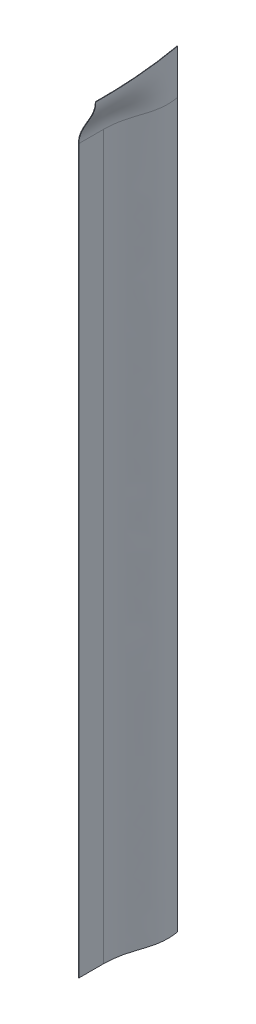
ISO-10303-21;
HEADER;
FILE_DESCRIPTION(('STEP AP214'),'2;1');
FILE_NAME('part.step','',(''),(''),'','','');
FILE_SCHEMA(('AUTOMOTIVE_DESIGN { 1 0 10303 214 1 1 1 1 }'));
ENDSEC;
DATA;
#1=APPLICATION_CONTEXT('core data for automotive mechanical design processes');
#2=APPLICATION_PROTOCOL_DEFINITION('international standard','automotive_design',2000,#1);
#3=PRODUCT_CONTEXT('',#1,'mechanical');
#4=PRODUCT('Part','Part','',(#3));
#5=PRODUCT_RELATED_PRODUCT_CATEGORY('part','',(#4));
#6=PRODUCT_DEFINITION_FORMATION('','',#4);
#7=PRODUCT_DEFINITION_CONTEXT('part definition',#1,'design');
#8=PRODUCT_DEFINITION('design','',#6,#7);
#9=PRODUCT_DEFINITION_SHAPE('','',#8);
#10=(LENGTH_UNIT() NAMED_UNIT(*) SI_UNIT(.MILLI.,.METRE.));
#11=(NAMED_UNIT(*) PLANE_ANGLE_UNIT() SI_UNIT($,.RADIAN.));
#12=(NAMED_UNIT(*) SI_UNIT($,.STERADIAN.) SOLID_ANGLE_UNIT());
#13=UNCERTAINTY_MEASURE_WITH_UNIT(LENGTH_MEASURE(1.E-05),#10,'distance_accuracy_value','');
#14=(GEOMETRIC_REPRESENTATION_CONTEXT(3) GLOBAL_UNCERTAINTY_ASSIGNED_CONTEXT((#13)) GLOBAL_UNIT_ASSIGNED_CONTEXT((#10,
#11,#12)) REPRESENTATION_CONTEXT('',''));
#15=CARTESIAN_POINT('',(0.,0.,0.));
#16=DIRECTION('',(0.,0.,1.));
#17=DIRECTION('',(1.,0.,0.));
#18=AXIS2_PLACEMENT_3D('',#15,#16,#17);
#19=CARTESIAN_POINT('',(2097.2,0.,12.4));
#20=DIRECTION('',(0.,0.,-1.));
#21=DIRECTION('',(0.,-1.,0.));
#22=AXIS2_PLACEMENT_3D('',#19,#20,#21);
#23=PLANE('',#22);
#24=CARTESIAN_POINT('',(2096.2,0.,12.4));
#25=CARTESIAN_POINT('',(2097.2,0.,12.4));
#26=B_SPLINE_CURVE_WITH_KNOTS('',1,(#24,#25),.UNSPECIFIED.,.F.,.F.,(2,2),(0.,1.),.UNSPECIFIED.);
#27=CARTESIAN_POINT('',(2096.2,0.,12.4));
#28=VERTEX_POINT('',#27);
#29=CARTESIAN_POINT('',(2097.2,0.,12.4));
#30=VERTEX_POINT('',#29);
#31=EDGE_CURVE('E12',#28,#30,#26,.T.);
#32=ORIENTED_EDGE('',*,*,#31,.F.);
#33=DIRECTION('',(0.,1.,0.));
#34=VECTOR('',#33,1.);
#35=CARTESIAN_POINT('',(2096.2,0.,12.4));
#36=LINE('',#35,#34);
#37=CARTESIAN_POINT('',(2096.2,-1628.,12.4));
#38=VERTEX_POINT('',#37);
#39=EDGE_CURVE('E167',#28,#38,#36,.F.);
#40=ORIENTED_EDGE('',*,*,#39,.T.);
#41=DIRECTION('',(1.,0.,0.));
#42=VECTOR('',#41,1.);
#43=CARTESIAN_POINT('',(2097.2,-1628.,12.4));
#44=LINE('',#43,#42);
#45=CARTESIAN_POINT('',(2097.2,-1628.,12.4));
#46=VERTEX_POINT('',#45);
#47=EDGE_CURVE('E96',#38,#46,#44,.T.);
#48=ORIENTED_EDGE('',*,*,#47,.T.);
#49=DIRECTION('',(0.,-1.,0.));
#50=VECTOR('',#49,1.);
#51=CARTESIAN_POINT('',(2097.2,0.,12.4));
#52=LINE('',#51,#50);
#53=EDGE_CURVE('E363',#30,#46,#52,.T.);
#54=ORIENTED_EDGE('',*,*,#53,.F.);
#55=EDGE_LOOP('',(#32,#40,#48,#54));
#56=FACE_BOUND('',#55,.T.);
#57=ADVANCED_FACE('F84',(#56),#23,.F.);
#58=CARTESIAN_POINT('',(2110.51087200424,-1628.,-116.599616087288));
#59=DIRECTION('',(0.,1.,0.));
#60=DIRECTION('',(0.,0.,1.));
#61=AXIS2_PLACEMENT_3D('',#58,#59,#60);
#62=PLANE('',#61);
#63=CARTESIAN_POINT('',(2097.2,-1628.,-42.6));
#64=CARTESIAN_POINT('',(2097.2,-1628.,-106.912759064299));
#65=CARTESIAN_POINT('',(2129.23437119317,-1628.,-128.285705284854));
#66=CARTESIAN_POINT('',(2118.40911682379,-1628.,-188.6));
#67=B_SPLINE_CURVE_WITH_KNOTS('',3,(#63,#64,#65,#66),.UNSPECIFIED.,.F.,.F.,(4,4),(0.,1.),.UNSPECIFIED.);
#68=CARTESIAN_POINT('',(2097.2,-1628.,-42.6));
#69=VERTEX_POINT('',#68);
#70=CARTESIAN_POINT('',(2118.40911682379,-1628.,-188.6));
#71=VERTEX_POINT('',#70);
#72=EDGE_CURVE('E173',#69,#71,#67,.T.);
#73=ORIENTED_EDGE('',*,*,#72,.F.);
#74=DIRECTION('',(0.,0.,-1.));
#75=VECTOR('',#74,1.);
#76=CARTESIAN_POINT('',(2097.2,-1628.,12.4));
#77=LINE('',#76,#75);
#78=EDGE_CURVE('E346',#46,#69,#77,.T.);
#79=ORIENTED_EDGE('',*,*,#78,.F.);
#80=ORIENTED_EDGE('',*,*,#47,.F.);
#81=DIRECTION('',(0.,0.,1.));
#82=VECTOR('',#81,1.);
#83=CARTESIAN_POINT('',(2096.2,-1628.,12.4));
#84=LINE('',#83,#82);
#85=CARTESIAN_POINT('',(2096.2,-1628.,-42.6));
#86=VERTEX_POINT('',#85);
#87=EDGE_CURVE('E477',#38,#86,#84,.F.);
#88=ORIENTED_EDGE('',*,*,#87,.T.);
#89=CARTESIAN_POINT('',(2096.2,-1628.,-42.6000000011509));
#90=CARTESIAN_POINT('',(2096.19990502715,-1628.,-44.5793698336326));
#91=CARTESIAN_POINT('',(2096.23018262602,-1628.,-46.5588160641818));
#92=CARTESIAN_POINT('',(2096.35151660415,-1628.,-50.438728948176));
#93=CARTESIAN_POINT('',(2096.44016217413,-1628.,-52.3392717592438));
#94=CARTESIAN_POINT('',(2096.67357865754,-1628.,-56.066249433123));
#95=CARTESIAN_POINT('',(2096.81614808163,-1628.,-57.8928207308748));
#96=CARTESIAN_POINT('',(2097.15249304741,-1628.,-61.4765869409018));
#97=CARTESIAN_POINT('',(2097.34429794904,-1628.,-63.233968858857));
#98=CARTESIAN_POINT('',(2097.9794804608,-1628.,-68.3282263089134));
#99=CARTESIAN_POINT('',(2098.49352046335,-1628.,-71.6565802443127));
#100=CARTESIAN_POINT('',(2099.67505619569,-1628.,-78.0921295844799));
#101=CARTESIAN_POINT('',(2100.3322973433,-1628.,-81.2012367614997));
#102=CARTESIAN_POINT('',(2101.75914326479,-1628.,-87.2377505073896));
#103=CARTESIAN_POINT('',(2102.52194376969,-1628.,-90.1667832511682));
#104=CARTESIAN_POINT('',(2104.11935034265,-1628.,-95.8828694121613));
#105=CARTESIAN_POINT('',(2104.95004104033,-1628.,-98.6710344899409));
#106=CARTESIAN_POINT('',(2106.64348015437,-1628.,-104.145645340672));
#107=CARTESIAN_POINT('',(2107.50451550666,-1628.,-106.832630368816));
#108=CARTESIAN_POINT('',(2109.21991885953,-1628.,-112.145371868147));
#109=CARTESIAN_POINT('',(2110.07403656934,-1628.,-114.771210497315));
#110=CARTESIAN_POINT('',(2111.73801771725,-1628.,-120.002131856168));
#111=CARTESIAN_POINT('',(2112.54829117227,-1628.,-122.607082022911));
#112=CARTESIAN_POINT('',(2114.08815083375,-1628.,-127.836925792426));
#113=CARTESIAN_POINT('',(2114.81786190087,-1628.,-130.461781598659));
#114=CARTESIAN_POINT('',(2115.82248893525,-1628.,-134.430917832449));
#115=CARTESIAN_POINT('',(2116.14325243351,-1628.,-135.763573779679));
#116=CARTESIAN_POINT('',(2116.75157586256,-1628.,-138.448796102679));
#117=CARTESIAN_POINT('',(2117.03881952384,-1628.,-139.801434558344));
#118=CARTESIAN_POINT('',(2117.57579334893,-1628.,-142.531709758811));
#119=CARTESIAN_POINT('',(2117.82501074076,-1628.,-143.909447834702));
#120=CARTESIAN_POINT('',(2118.28169899438,-1628.,-146.69504189206));
#121=CARTESIAN_POINT('',(2118.48841912707,-1628.,-148.103021535132));
#122=CARTESIAN_POINT('',(2118.85589793826,-1628.,-150.954249672633));
#123=CARTESIAN_POINT('',(2119.01563099993,-1628.,-152.397630900081));
#124=CARTESIAN_POINT('',(2119.28493765844,-1628.,-155.3248452835));
#125=CARTESIAN_POINT('',(2119.39318255985,-1628.,-156.808801075264));
#126=CARTESIAN_POINT('',(2119.5553126968,-1628.,-159.822376510054));
#127=CARTESIAN_POINT('',(2119.60754948588,-1628.,-161.352084931298));
#128=CARTESIAN_POINT('',(2119.6534465387,-1628.,-164.462401591432));
#129=CARTESIAN_POINT('',(2119.64513554964,-1628.,-166.043038596721));
#130=CARTESIAN_POINT('',(2119.56568862979,-1628.,-169.260461173176));
#131=CARTESIAN_POINT('',(2119.49226969245,-1628.,-170.897189440844));
#132=CARTESIAN_POINT('',(2119.27831808195,-1628.,-174.232059496873));
#133=CARTESIAN_POINT('',(2119.13521490906,-1628.,-175.930035172123));
#134=CARTESIAN_POINT('',(2118.77754906701,-1628.,-179.392620948449));
#135=CARTESIAN_POINT('',(2118.56016304896,-1628.,-181.156936263098));
#136=CARTESIAN_POINT('',(2118.04956125865,-1628.,-184.757570124325));
#137=CARTESIAN_POINT('',(2117.75331308361,-1628.,-186.59346068506));
#138=CARTESIAN_POINT('',(2117.42484451491,-1628.,-188.423342076413));
#139=B_SPLINE_CURVE_WITH_KNOTS('',3,(#89,#90,#91,#92,#93,#94,#95,#96,#97,#98,#99,#100,#101,#102,
#103,#104,#105,#106,#107,#108,#109,#110,#111,#112,#113,#114,#115,#116,#117,#118,#119,#120,#121,
#122,#123,#124,#125,#126,#127,#128,#129,#130,#131,#132,#133,#134,#135,#136,#137,#138),
.UNSPECIFIED.,.F.,.F.,(4,2,2,2,2,2,2,2,2,2,2,2,2,2,2,2,2,2,2,2,2,2,2,2,4),(0.,5.93797783504371,
11.6449026489515,17.1403530017418,22.4431232814159,32.5403385186683,42.0697649595287,
51.1474109368386,59.874164470115,68.3387201667411,76.6225127654291,84.8062148293339,
92.9770497441407,97.0887798413055,101.236612522311,105.436197644087,109.704576583658,
114.060185370628,118.522800121677,123.113430308563,127.854169966007,132.768020417092,
137.878699370403,143.210450578175,148.787865745676),.UNSPECIFIED.);
#140=CARTESIAN_POINT('',(2117.42484451504,-1628.,-188.423342075684));
#141=VERTEX_POINT('',#140);
#142=EDGE_CURVE('E471',#86,#141,#139,.T.);
#143=ORIENTED_EDGE('',*,*,#142,.T.);
#144=DIRECTION('',(0.984272308752147,0.,-0.176657924316226));
#145=VECTOR('',#144,1.);
#146=CARTESIAN_POINT('',(2118.40911682379,-1628.,-188.6));
#147=LINE('',#146,#145);
#148=EDGE_CURVE('E156',#141,#71,#147,.T.);
#149=ORIENTED_EDGE('',*,*,#148,.T.);
#150=EDGE_LOOP('',(#73,#79,#80,#88,#143,#149));
#151=FACE_BOUND('',#150,.T.);
#152=ADVANCED_FACE('F329',(#151),#62,.F.);
#153=CARTESIAN_POINT('',(2118.40911682379,0.,-188.6));
#154=DIRECTION('',(-0.176657924316203,0.,-0.984272308752152));
#155=DIRECTION('',(-0.984272308752152,0.,0.176657924316203));
#156=AXIS2_PLACEMENT_3D('',#153,#154,#155);
#157=PLANE('',#156);
#158=CARTESIAN_POINT('',(2118.40911682379,0.,-188.6));
#159=CARTESIAN_POINT('',(2118.40911682379,33.3333333333333,-188.6));
#160=CARTESIAN_POINT('',(2118.40911682379,66.6666666666667,-188.599999999999));
#161=CARTESIAN_POINT('',(2118.40911682379,100.,-188.599999999999));
#162=B_SPLINE_CURVE_WITH_KNOTS('',3,(#158,#159,#160,#161),.UNSPECIFIED.,.F.,.F.,(4,4),(0.,1.),.UNSPECIFIED.);
#163=CARTESIAN_POINT('',(2118.40911682379,0.,-188.6));
#164=VERTEX_POINT('',#163);
#165=CARTESIAN_POINT('',(2118.40911682379,100.,-188.599999999999));
#166=VERTEX_POINT('',#165);
#167=EDGE_CURVE('E360',#164,#166,#162,.T.);
#168=ORIENTED_EDGE('',*,*,#167,.F.);
#169=DIRECTION('',(0.,-1.,0.));
#170=VECTOR('',#169,1.);
#171=CARTESIAN_POINT('',(2118.40911682379,0.,-188.6));
#172=LINE('',#171,#170);
#173=EDGE_CURVE('E352',#164,#71,#172,.T.);
#174=ORIENTED_EDGE('',*,*,#173,.T.);
#175=ORIENTED_EDGE('',*,*,#148,.F.);
#176=DIRECTION('',(0.,-1.,0.));
#177=VECTOR('',#176,1.);
#178=CARTESIAN_POINT('',(2117.42484451504,0.,-188.423342075684));
#179=LINE('',#178,#177);
#180=CARTESIAN_POINT('',(2117.42484451504,0.,-188.423342075684));
#181=VERTEX_POINT('',#180);
#182=EDGE_CURVE('E163',#181,#141,#179,.T.);
#183=ORIENTED_EDGE('',*,*,#182,.F.);
#184=CARTESIAN_POINT('',(2117.42484451504,0.,-188.423342075684));
#185=CARTESIAN_POINT('',(2117.42484451504,16.6666666666667,-188.423342075684));
#186=CARTESIAN_POINT('',(2117.42484451504,33.3333333333333,-188.423342075684));
#187=CARTESIAN_POINT('',(2117.42484451504,58.3333333333333,-188.423342075683));
#188=CARTESIAN_POINT('',(2117.42484451504,66.6666666666667,-188.423342075683));
#189=CARTESIAN_POINT('',(2117.42484451504,83.3333333333333,-188.423342075683));
#190=CARTESIAN_POINT('',(2117.42484451504,91.6666666666667,-188.423342075683));
#191=CARTESIAN_POINT('',(2117.42484451504,100.,-188.423342075683));
#192=B_SPLINE_CURVE_WITH_KNOTS('',3,(#184,#185,#186,#187,#188,#189,#190,#191),.UNSPECIFIED.,.F.,
.F.,(4,2,2,4),(0.,50.,75.,100.),.UNSPECIFIED.);
#193=CARTESIAN_POINT('',(2117.42484451504,100.,-188.423342075683));
#194=VERTEX_POINT('',#193);
#195=EDGE_CURVE('E160',#181,#194,#192,.T.);
#196=ORIENTED_EDGE('',*,*,#195,.T.);
#197=CARTESIAN_POINT('',(2117.42484451504,100.,-188.423342075683));
#198=CARTESIAN_POINT('',(2117.50687087374,100.,-188.438064227407));
#199=CARTESIAN_POINT('',(2117.58889723244,100.,-188.452786379131));
#200=CARTESIAN_POINT('',(2117.75294994984,100.,-188.482230682579));
#201=CARTESIAN_POINT('',(2117.83497630854,100.,-188.496952834303));
#202=CARTESIAN_POINT('',(2118.08104071943,100.,-188.541116657351));
#203=CARTESIAN_POINT('',(2118.24507877161,100.,-188.570558328675));
#204=CARTESIAN_POINT('',(2118.40911682379,100.,-188.599999999999));
#205=B_SPLINE_CURVE_WITH_KNOTS('',3,(#197,#198,#199,#200,#201,#202,#203,#204),.UNSPECIFIED.,.F.,
.F.,(4,2,2,4),(0.,0.250011174665922,0.500022349331874,1.00000000000012),.UNSPECIFIED.);
#206=EDGE_CURVE('E146',#194,#166,#205,.T.);
#207=ORIENTED_EDGE('',*,*,#206,.T.);
#208=EDGE_LOOP('',(#168,#174,#175,#183,#196,#207));
#209=FACE_BOUND('',#208,.T.);
#210=ADVANCED_FACE('F161',(#209),#157,.T.);
#211=CARTESIAN_POINT('',(2118.40911682379,100.,-188.599999999999));
#212=DIRECTION('',(0.,1.,0.));
#213=DIRECTION('',(-0.984272308752156,0.,0.176657924316176));
#214=AXIS2_PLACEMENT_3D('',#211,#212,#213);
#215=PLANE('',#214);
#216=ORIENTED_EDGE('',*,*,#206,.F.);
#217=CARTESIAN_POINT('',(2117.42484451504,100.,-188.423342075683));
#218=CARTESIAN_POINT('',(2117.91178197751,100.,-185.710232373201));
#219=CARTESIAN_POINT('',(2118.3881193827,100.,-182.995222267723));
#220=CARTESIAN_POINT('',(2119.31969577176,100.,-177.561586026702));
#221=CARTESIAN_POINT('',(2119.77493476611,100.,-174.842959892954));
#222=CARTESIAN_POINT('',(2120.66443136324,100.,-169.402182824546));
#223=CARTESIAN_POINT('',(2121.09868826478,100.,-166.680031775195));
#224=CARTESIAN_POINT('',(2121.94620497464,100.,-161.232468893543));
#225=CARTESIAN_POINT('',(2122.35946477662,100.,-158.507057060255));
#226=CARTESIAN_POINT('',(2123.56770280458,100.,-150.326080262677));
#227=CARTESIAN_POINT('',(2124.33113250242,100.,-144.865817735663));
#228=CARTESIAN_POINT('',(2125.77214994862,100.,-133.935913183818));
#229=CARTESIAN_POINT('',(2126.44976716576,100.,-128.466275036221));
#230=CARTESIAN_POINT('',(2127.72034870304,100.,-117.517268191796));
#231=CARTESIAN_POINT('',(2128.31331435345,100.,-112.037899649247));
#232=CARTESIAN_POINT('',(2129.41464271444,100.,-101.07082151532));
#233=CARTESIAN_POINT('',(2129.92300819868,100.,-95.5831122033536));
#234=CARTESIAN_POINT('',(2130.62905499581,100.,-87.2550861389634));
#235=CARTESIAN_POINT('',(2130.85812611098,100.,-84.417397726531));
#236=CARTESIAN_POINT('',(2131.29349397135,100.,-78.7403039952867));
#237=CARTESIAN_POINT('',(2131.49979100154,100.,-75.9008986984062));
#238=CARTESIAN_POINT('',(2131.8896716982,100.,-70.220532713023));
#239=CARTESIAN_POINT('',(2132.07325537851,100.,-67.379572025469));
#240=CARTESIAN_POINT('',(2132.41772597561,100.,-61.6962978414668));
#241=CARTESIAN_POINT('',(2132.57861307781,100.,-58.8539843562601));
#242=CARTESIAN_POINT('',(2132.87767673184,100.,-53.1681582286987));
#243=CARTESIAN_POINT('',(2133.01585324623,100.,-50.3246455843753));
#244=CARTESIAN_POINT('',(2133.26941863,100.,-44.6366207249578));
#245=CARTESIAN_POINT('',(2133.3848076331,100.,-41.7921085158275));
#246=CARTESIAN_POINT('',(2133.59299093205,100.,-36.0959776832799));
#247=CARTESIAN_POINT('',(2133.68573484467,100.,-33.244357220516));
#248=CARTESIAN_POINT('',(2133.84832044127,100.,-27.5404529256612));
#249=CARTESIAN_POINT('',(2133.91816206885,100.,-24.688169091954));
#250=CARTESIAN_POINT('',(2134.00575238443,100.,-20.409382710622));
#251=CARTESIAN_POINT('',(2134.03208725486,100.,-18.9830508706681));
#252=CARTESIAN_POINT('',(2134.0790340287,100.,-16.1302905919716));
#253=CARTESIAN_POINT('',(2134.09964592715,100.,-14.7038621531466));
#254=CARTESIAN_POINT('',(2134.12923034158,100.,-12.326426940495));
#255=CARTESIAN_POINT('',(2134.1397924353,100.,-11.375439565598));
#256=CARTESIAN_POINT('',(2134.15837382631,100.,-9.47344049960771));
#257=CARTESIAN_POINT('',(2134.16639312536,100.,-8.52242880853165));
#258=CARTESIAN_POINT('',(2134.17988797628,100.,-6.62038975425363));
#259=CARTESIAN_POINT('',(2134.18536353471,100.,-5.66936239109846));
#260=CARTESIAN_POINT('',(2134.19167227653,100.,-4.24281370034143));
#261=CARTESIAN_POINT('',(2134.19345775746,100.,-3.76729641221583));
#262=CARTESIAN_POINT('',(2134.19638860059,100.,-2.81626001457154));
#263=CARTESIAN_POINT('',(2134.19753396302,100.,-2.34074090505353));
#264=CARTESIAN_POINT('',(2134.19920603035,100.,-1.38970067920241));
#265=CARTESIAN_POINT('',(2134.1997327341,100.,-0.914179562867199));
#266=CARTESIAN_POINT('',(2134.19999840388,100.,-0.200897674447772));
#267=CARTESIAN_POINT('',(2134.19999956279,100.,0.0368630312709143));
#268=CARTESIAN_POINT('',(2134.20000043721,100.,0.512384444106765));
#269=CARTESIAN_POINT('',(2134.20000015271,100.,0.750145151223929));
#270=CARTESIAN_POINT('',(2134.19999969458,100.,1.46342814452927));
#271=CARTESIAN_POINT('',(2134.19999991632,100.,1.93895043307451));
#272=CARTESIAN_POINT('',(2134.20000008368,100.,2.88999499978504));
#273=CARTESIAN_POINT('',(2134.20000002929,100.,3.36551727795033));
#274=CARTESIAN_POINT('',(2134.19999994143,100.,4.79203854977996));
#275=CARTESIAN_POINT('',(2134.19999998327,100.,5.74303754389322));
#276=CARTESIAN_POINT('',(2134.20000001673,100.,7.64503304887715));
#277=CARTESIAN_POINT('',(2134.20000000837,100.,8.59602955974782));
#278=CARTESIAN_POINT('',(2134.19999999163,100.,10.4980173803626));
#279=CARTESIAN_POINT('',(2134.19999998327,100.,11.4490086901068));
#280=CARTESIAN_POINT('',(2134.2,100.,12.4000000000006));
#281=B_SPLINE_CURVE_WITH_KNOTS('',3,(#217,#218,#219,#220,#221,#222,#223,#224,#225,#226,#227,
#228,#229,#230,#231,#232,#233,#234,#235,#236,#237,#238,#239,#240,#241,#242,#243,#244,#245,#246,
#247,#248,#249,#250,#251,#252,#253,#254,#255,#256,#257,#258,#259,#260,#261,#262,#263,#264,#265,
#266,#267,#268,#269,#270,#271,#272,#273,#274,#275,#276,#277,#278,#279,#280),.UNSPECIFIED.,.F.,
.F.,(4,2,2,2,2,2,2,2,2,2,2,2,2,2,2,2,2,2,2,2,2,2,2,2,2,2,2,2,2,2,2,4),(0.,8.26935586366066,
16.5387076258297,24.8083355710459,33.0779660215668,49.6173598554222,66.1510584202685,
82.6844971362546,99.2173936886634,107.758074363038,116.298648151504,124.8392167359,
133.379715547593,141.9202284356,150.460691205333,159.019986021266,167.579301912177,
171.859017506722,176.138736803623,178.991871855254,181.845004931658,184.698130644164,
186.124692201635,187.551253263816,188.977816969561,189.69109906599,190.40438119243,
191.830948054099,193.257514889568,196.11051187116,198.963501403921,201.816475333303),.UNSPECIFIED.);
#282=CARTESIAN_POINT('',(2134.2,100.,12.4000000000006));
#283=VERTEX_POINT('',#282);
#284=EDGE_CURVE('E149',#194,#283,#281,.T.);
#285=ORIENTED_EDGE('',*,*,#284,.T.);
#286=CARTESIAN_POINT('',(2134.2,100.,12.4000000000006));
#287=CARTESIAN_POINT('',(2134.28366382318,100.,12.4000000000005));
#288=CARTESIAN_POINT('',(2134.36732764637,100.,12.4000000000005));
#289=CARTESIAN_POINT('',(2134.53465529274,100.,12.4000000000004));
#290=CARTESIAN_POINT('',(2134.61831911592,100.,12.4000000000003));
#291=CARTESIAN_POINT('',(2134.86798862607,100.,12.4000000000002));
#292=CARTESIAN_POINT('',(2135.03399431304,99.9999999999999,12.4000000000001));
#293=CARTESIAN_POINT('',(2135.2,100.,12.4));
#294=B_SPLINE_CURVE_WITH_KNOTS('',3,(#286,#287,#288,#289,#290,#291,#292,#293),.UNSPECIFIED.,.F.,
.F.,(4,2,2,4),(0.,0.250991469555206,0.501982939109968,0.99999999999989),.UNSPECIFIED.);
#295=CARTESIAN_POINT('',(2135.2,100.,12.4));
#296=VERTEX_POINT('',#295);
#297=EDGE_CURVE('E139',#283,#296,#294,.T.);
#298=ORIENTED_EDGE('',*,*,#297,.T.);
#299=CARTESIAN_POINT('',(2118.40911682379,100.,-188.599999999999));
#300=CARTESIAN_POINT('',(2119.88208806674,100.,-180.393151585847));
#301=CARTESIAN_POINT('',(2121.95195860461,100.,-168.022680719978));
#302=CARTESIAN_POINT('',(2124.41820818405,100.,-151.514741664519));
#303=CARTESIAN_POINT('',(2126.11750517861,100.,-139.153403069519));
#304=CARTESIAN_POINT('',(2127.66281069534,100.,-126.838284818192));
#305=CARTESIAN_POINT('',(2129.05557294793,100.,-114.591784061294));
#306=CARTESIAN_POINT('',(2130.29724015011,100.,-102.436297949585));
#307=CARTESIAN_POINT('',(2131.75326730406,100.,-86.3801988618984));
#308=CARTESIAN_POINT('',(2132.91289721201,100.,-70.595717667617));
#309=CARTESIAN_POINT('',(2133.79589889138,100.,-55.1354005603097));
#310=CARTESIAN_POINT('',(2134.50107142417,100.,-39.9087082421751));
#311=CARTESIAN_POINT('',(2135.06146307623,100.,-21.3462306951862));
#312=CARTESIAN_POINT('',(2135.2,100.,-7.02340488495266));
#313=CARTESIAN_POINT('',(2135.2,100.,2.78610772566117));
#314=CARTESIAN_POINT('',(2135.2,99.9999999999999,4.32038402832956));
#315=CARTESIAN_POINT('',(2135.2,100.,7.77245619494941));
#316=CARTESIAN_POINT('',(2135.2,99.9999999999999,9.92087628852595));
#317=CARTESIAN_POINT('',(2135.2,100.,11.6139298361816));
#318=CARTESIAN_POINT('',(2135.2,100.,12.4));
#319=B_SPLINE_CURVE_WITH_KNOTS('',3,(#299,#300,#301,#302,#303,#304,#305,#306,#307,#308,#309,
#310,#311,#312,#313,#314,#315,#316,#317,#318),.UNSPECIFIED.,.F.,.F.,(4,1,1,1,1,1,1,1,1,1,1,1,2,
1,1,1,4),(0.,0.104310570158004,0.156465855237007,0.208621140316009,0.260776425395011,
0.312931710474013,0.365086995553016,0.417242280632018,0.521552850790022,0.573708135869025,
0.625863420948027,0.730173991106031,0.834484561264036,0.875863420948027,0.917242280632018,
0.958621140316009,1.),.UNSPECIFIED.);
#320=EDGE_CURVE('E152',#166,#296,#319,.T.);
#321=ORIENTED_EDGE('',*,*,#320,.F.);
#322=EDGE_LOOP('',(#216,#285,#298,#321));
#323=FACE_BOUND('',#322,.T.);
#324=ADVANCED_FACE('F86',(#323),#215,.T.);
#325=CARTESIAN_POINT('',(2135.2,100.,12.4));
#326=CARTESIAN_POINT('',(2135.2,95.5426402932279,12.4));
#327=CARTESIAN_POINT('',(2134.60625,91.1942904764953,12.4));
#328=CARTESIAN_POINT('',(2132.528125,82.6611056780895,12.4));
#329=CARTESIAN_POINT('',(2131.04375,78.4762706964163,12.4));
#330=CARTESIAN_POINT('',(2127.48125,70.2156106231093,12.4));
#331=CARTESIAN_POINT('',(2125.403125,66.1397855314755,12.4));
#332=CARTESIAN_POINT('',(2120.95,58.0426402932279,12.4));
#333=CARTESIAN_POINT('',(2118.575,54.0213201466139,12.4));
#334=CARTESIAN_POINT('',(2113.825,45.9786798533861,12.4));
#335=CARTESIAN_POINT('',(2111.45,41.9573597067721,12.4));
#336=CARTESIAN_POINT('',(2106.996875,33.8602144685244,12.4));
#337=CARTESIAN_POINT('',(2104.91875,29.7843893768907,12.4));
#338=CARTESIAN_POINT('',(2101.35625,21.5237293035838,12.4));
#339=CARTESIAN_POINT('',(2099.871875,17.3388943219105,12.4));
#340=CARTESIAN_POINT('',(2097.79375,8.80570952350468,12.4));
#341=CARTESIAN_POINT('',(2097.2,4.45735970677211,12.4));
#342=CARTESIAN_POINT('',(2097.2,0.,12.4));
#343=CARTESIAN_POINT('',(2134.2,100.,12.4000000000006));
#344=CARTESIAN_POINT('',(2134.2,95.6317889591355,12.4000000000006));
#345=CARTESIAN_POINT('',(2133.61841304395,91.3642353428358,12.397232994011));
#346=CARTESIAN_POINT('',(2131.57277321617,82.9643943342219,12.3945478567797));
#347=CARTESIAN_POINT('',(2130.10824934603,78.8322318267454,12.394380267859));
#348=CARTESIAN_POINT('',(2126.58027769514,70.6516485410154,12.3953933418695));
#349=CARTESIAN_POINT('',(2124.51694372154,66.603571924068,12.3964281186735));
#350=CARTESIAN_POINT('',(2120.08372753483,58.5426374746547,12.3983662198052));
#351=CARTESIAN_POINT('',(2117.7139577107,54.5298535044506,12.3992918456803));
#352=CARTESIAN_POINT('',(2112.9639577107,46.4872132112227,12.4007081543196));
#353=CARTESIAN_POINT('',(2110.58372740933,42.4573570112561,12.4012102194832));
#354=CARTESIAN_POINT('',(2106.11068983115,34.324002946651,12.4017505813105));
#355=CARTESIAN_POINT('',(2104.01776973102,30.2204312864212,12.4017888546788));
#356=CARTESIAN_POINT('',(2100.42073576726,21.8796957328942,12.4014877818176));
#357=CARTESIAN_POINT('',(2098.91651034856,17.6421866872059,12.4011405717174));
#358=CARTESIAN_POINT('',(2096.805910079,8.97565453645932,12.4004000258162));
#359=CARTESIAN_POINT('',(2096.2,4.54650813341957,12.4));
#360=CARTESIAN_POINT('',(2096.2,0.,12.4));
#361=B_SPLINE_SURFACE_WITH_KNOTS('',1,3,((#325,#326,#327,#328,#329,#330,#331,#332,#333,#334,
#335,#336,#337,#338,#339,#340,#341,#342),(#343,#344,#345,#346,#347,#348,#349,#350,#351,#352,
#353,#354,#355,#356,#357,#358,#359,#360)),.UNSPECIFIED.,.F.,.F.,.F.,(2,2),(4,2,2,2,2,2,2,2,4),
(0.,1.),(0.,0.125,0.25,0.375,0.5,0.625,0.75,0.875,1.),.UNSPECIFIED.);
#362=CARTESIAN_POINT('',(2134.2,100.,12.4000000000006));
#363=CARTESIAN_POINT('',(2134.2,95.6317889591355,12.4000000000006));
#364=CARTESIAN_POINT('',(2133.61841304395,91.3642353428358,12.397232994011));
#365=CARTESIAN_POINT('',(2131.57277321617,82.9643943342219,12.3945478567797));
#366=CARTESIAN_POINT('',(2130.10824934603,78.8322318267454,12.394380267859));
#367=CARTESIAN_POINT('',(2126.58027769514,70.6516485410154,12.3953933418695));
#368=CARTESIAN_POINT('',(2124.51694372154,66.603571924068,12.3964281186735));
#369=CARTESIAN_POINT('',(2120.08372753483,58.5426374746547,12.3983662198052));
#370=CARTESIAN_POINT('',(2117.7139577107,54.5298535044506,12.3992918456803));
#371=CARTESIAN_POINT('',(2112.9639577107,46.4872132112227,12.4007081543196));
#372=CARTESIAN_POINT('',(2110.58372740933,42.4573570112561,12.4012102194832));
#373=CARTESIAN_POINT('',(2106.11068983115,34.324002946651,12.4017505813105));
#374=CARTESIAN_POINT('',(2104.01776973102,30.2204312864212,12.4017888546788));
#375=CARTESIAN_POINT('',(2100.42073576726,21.8796957328942,12.4014877818176));
#376=CARTESIAN_POINT('',(2098.91651034856,17.6421866872059,12.4011405717174));
#377=CARTESIAN_POINT('',(2096.805910079,8.97565453645932,12.4004000258162));
#378=CARTESIAN_POINT('',(2096.2,4.54650813341957,12.4));
#379=CARTESIAN_POINT('',(2096.2,0.,12.4));
#380=B_SPLINE_CURVE_WITH_KNOTS('',3,(#362,#363,#364,#365,#366,#367,#368,#369,#370,#371,#372,
#373,#374,#375,#376,#377,#378,#379),.UNSPECIFIED.,.F.,.F.,(4,2,2,2,2,2,2,2,4),(0.,0.125,0.25,
0.375,0.5,0.625,0.75,0.875,1.),.UNSPECIFIED.);
#381=EDGE_CURVE('E171',#283,#28,#380,.T.);
#382=CARTESIAN_POINT('',(2135.2,100.,12.4));
#383=CARTESIAN_POINT('',(2135.2,64.3411223458231,12.4));
#384=CARTESIAN_POINT('',(2097.2,35.6588776541769,12.4));
#385=CARTESIAN_POINT('',(2097.2,0.,12.4));
#386=B_SPLINE_CURVE_WITH_KNOTS('',3,(#382,#383,#384,#385),.UNSPECIFIED.,.F.,.F.,(4,4),(0.,1.),.UNSPECIFIED.);
#387=EDGE_CURVE('E259',#296,#30,#386,.T.);
#388=ORIENTED_EDGE('',*,*,#381,.T.);
#389=ORIENTED_EDGE('',*,*,#31,.T.);
#390=ORIENTED_EDGE('',*,*,#387,.F.);
#391=ORIENTED_EDGE('',*,*,#297,.F.);
#392=EDGE_LOOP('',(#388,#389,#390,#391));
#393=FACE_BOUND('',#392,.T.);
#394=ADVANCED_FACE('F213',(#393),#361,.T.);
#395=CARTESIAN_POINT('',(2118.40911682379,100.,-188.599999999999));
#396=CARTESIAN_POINT('',(2118.40911682379,66.6666666666667,-188.599999999999));
#397=CARTESIAN_POINT('',(2118.40911682379,33.3333333333333,-188.6));
#398=CARTESIAN_POINT('',(2118.40911682379,0.,-188.6));
#399=CARTESIAN_POINT('',(2119.88208806674,100.,-180.393151585847));
#400=CARTESIAN_POINT('',(2119.88208806674,66.6497434385605,-180.393151585847));
#401=CARTESIAN_POINT('',(2119.44127554205,33.3502565614395,-182.849195168871));
#402=CARTESIAN_POINT('',(2119.44127554205,0.,-182.849195168871));
#403=CARTESIAN_POINT('',(2121.95195860461,100.,-168.022680719978));
#404=CARTESIAN_POINT('',(2121.95195860461,66.6243585964012,-168.022680719978));
#405=CARTESIAN_POINT('',(2120.51525210332,33.3756414035988,-174.134180537152));
#406=CARTESIAN_POINT('',(2120.51525210332,0.,-174.134180537152));
#407=CARTESIAN_POINT('',(2124.41820818405,100.,-151.514741664519));
#408=CARTESIAN_POINT('',(2124.41820818405,66.4555190915975,-151.514741664519));
#409=CARTESIAN_POINT('',(2120.73109858834,33.5444809084025,-162.398391623543));
#410=CARTESIAN_POINT('',(2120.73109858834,0.,-162.398391623543));
#411=CARTESIAN_POINT('',(2126.11750517861,100.,-139.153403069519));
#412=CARTESIAN_POINT('',(2126.11750517861,66.2747895738081,-139.153403069519));
#413=CARTESIAN_POINT('',(2120.23922240834,33.7252104261919,-153.57769423501));
#414=CARTESIAN_POINT('',(2120.23922240834,0.,-153.57769423501));
#415=CARTESIAN_POINT('',(2127.66281069534,100.,-126.838284818192));
#416=CARTESIAN_POINT('',(2127.66281069534,66.0251817298347,-126.838284818192));
#417=CARTESIAN_POINT('',(2119.083878432,33.9748182701653,-144.773779068907));
#418=CARTESIAN_POINT('',(2119.083878432,0.,-144.773779068907));
#419=CARTESIAN_POINT('',(2129.05557294793,100.,-114.591784061294));
#420=CARTESIAN_POINT('',(2129.05557294793,65.6981084177675,-114.591784061294));
#421=CARTESIAN_POINT('',(2117.31116045817,34.3018915822324,-136.017793462533));
#422=CARTESIAN_POINT('',(2117.31116045817,0.,-136.017793462533));
#423=CARTESIAN_POINT('',(2130.29724015011,100.,-102.436297949585));
#424=CARTESIAN_POINT('',(2130.29724015011,65.2879019826712,-102.436297949585));
#425=CARTESIAN_POINT('',(2115.02520282533,34.7120980173289,-127.311934070336));
#426=CARTESIAN_POINT('',(2115.02520282533,0.,-127.311934070336));
#427=CARTESIAN_POINT('',(2131.75326730406,100.,-86.3801988618984));
#428=CARTESIAN_POINT('',(2131.75326730406,64.6389435905973,-86.3801988618984));
#429=CARTESIAN_POINT('',(2111.49280877256,35.3610564094026,-115.729136604228));
#430=CARTESIAN_POINT('',(2111.49280877256,0.,-115.729136604228));
#431=CARTESIAN_POINT('',(2132.91289721201,100.,-70.595717667617));
#432=CARTESIAN_POINT('',(2132.91289721201,63.8681771869587,-70.595717667617));
#433=CARTESIAN_POINT('',(2107.58680629837,36.1318228130414,-104.061290120005));
#434=CARTESIAN_POINT('',(2107.58680629837,0.,-104.061290120005));
#435=CARTESIAN_POINT('',(2133.79589889138,100.,-55.1354005603097));
#436=CARTESIAN_POINT('',(2133.79589889138,63.1213805000343,-55.1354005603097));
#437=CARTESIAN_POINT('',(2104.01543075498,36.8786194999657,-92.0088602832408));
#438=CARTESIAN_POINT('',(2104.01543075498,0.,-92.0088602832408));
#439=CARTESIAN_POINT('',(2134.50107142417,100.,-39.9087082421751));
#440=CARTESIAN_POINT('',(2134.50107142417,62.4135267826497,-39.9087082421751));
#441=CARTESIAN_POINT('',(2100.84897784866,37.5864732173505,-79.6327127575437));
#442=CARTESIAN_POINT('',(2100.84897784866,0.,-79.6327127575437));
#443=CARTESIAN_POINT('',(2135.06146307623,100.,-21.3462306951862));
#444=CARTESIAN_POINT('',(2135.06146307623,61.9165955749273,-21.3462306951862));
#445=CARTESIAN_POINT('',(2097.98347362165,38.0834044250727,-63.4488530737987));
#446=CARTESIAN_POINT('',(2097.98347362165,0.,-63.4488530737987));
#447=CARTESIAN_POINT('',(2135.2,100.,-7.02340488495266));
#448=CARTESIAN_POINT('',(2135.2,61.3280197972377,-7.02340488495266));
#449=CARTESIAN_POINT('',(2097.2,38.6719802027623,-49.6921967389681));
#450=CARTESIAN_POINT('',(2097.2,0.,-49.6921967389681));
#451=CARTESIAN_POINT('',(2135.2,100.,2.78610772566117));
#452=CARTESIAN_POINT('',(2135.2,61.7327107468381,2.78610772566117));
#453=CARTESIAN_POINT('',(2097.2,38.2672892531619,-39.7866067288528));
#454=CARTESIAN_POINT('',(2097.2,0.,-39.7866067288528));
#455=CARTESIAN_POINT('',(2135.2,99.9999999999999,4.32038402832956));
#456=CARTESIAN_POINT('',(2135.2,62.1464032483003,4.32038402832956));
#457=CARTESIAN_POINT('',(2097.2,37.8535967516996,-33.5491481434379));
#458=CARTESIAN_POINT('',(2097.2,0.,-33.5491481434379));
#459=CARTESIAN_POINT('',(2135.2,100.,7.77245619494941));
#460=CARTESIAN_POINT('',(2135.2,63.0744119281783,7.77245619494941));
#461=CARTESIAN_POINT('',(2097.2,36.9255880718219,-21.696238341225));
#462=CARTESIAN_POINT('',(2097.2,0.,-21.696238341225));
#463=CARTESIAN_POINT('',(2135.2,99.9999999999999,9.92087628852595));
#464=CARTESIAN_POINT('',(2135.2,64.1320948012186,9.92087628852595));
#465=CARTESIAN_POINT('',(2097.2,35.8679051987813,-5.42750473387322));
#466=CARTESIAN_POINT('',(2097.2,0.,-5.42750473387322));
#467=CARTESIAN_POINT('',(2135.2,100.,11.6139298361816));
#468=CARTESIAN_POINT('',(2135.2,64.2714464976216,11.6139298361816));
#469=CARTESIAN_POINT('',(2097.2,35.7285535023783,6.93169663557358));
#470=CARTESIAN_POINT('',(2097.2,0.,6.93169663557358));
#471=CARTESIAN_POINT('',(2135.2,100.,12.4));
#472=CARTESIAN_POINT('',(2135.2,64.3411223458231,12.4));
#473=CARTESIAN_POINT('',(2097.2,35.6588776541769,12.4));
#474=CARTESIAN_POINT('',(2097.2,0.,12.4));
#475=B_SPLINE_SURFACE_WITH_KNOTS('',3,3,((#395,#396,#397,#398),(#399,#400,#401,#402),(#403,#404,
#405,#406),(#407,#408,#409,#410),(#411,#412,#413,#414),(#415,#416,#417,#418),(#419,#420,#421,
#422),(#423,#424,#425,#426),(#427,#428,#429,#430),(#431,#432,#433,#434),(#435,#436,#437,#438),
(#439,#440,#441,#442),(#443,#444,#445,#446),(#447,#448,#449,#450),(#451,#452,#453,#454),(#455,
#456,#457,#458),(#459,#460,#461,#462),(#463,#464,#465,#466),(#467,#468,#469,#470),(#471,#472,
#473,#474)),.UNSPECIFIED.,.F.,.F.,.F.,(4,1,1,1,1,1,1,1,1,1,1,1,2,1,1,1,4),(4,4),(0.,
0.104310570158004,0.156465855237007,0.208621140316009,0.260776425395011,0.312931710474013,
0.365086995553016,0.417242280632018,0.521552850790022,0.573708135869025,0.625863420948027,
0.730173991106031,0.834484561264036,0.875863420948027,0.917242280632018,0.958621140316009,1.),
(0.,1.),.UNSPECIFIED.);
#476=CARTESIAN_POINT('',(2097.2,0.,12.4));
#477=CARTESIAN_POINT('',(2097.2,0.,6.93169663557358));
#478=CARTESIAN_POINT('',(2097.2,0.,-5.42750473387322));
#479=CARTESIAN_POINT('',(2097.2,0.,-21.696238341225));
#480=CARTESIAN_POINT('',(2097.2,0.,-33.5491481434379));
#481=CARTESIAN_POINT('',(2097.2,0.,-39.7866067288528));
#482=CARTESIAN_POINT('',(2097.2,0.,-49.6921967389681));
#483=CARTESIAN_POINT('',(2097.98347362165,0.,-63.4488530737987));
#484=CARTESIAN_POINT('',(2100.84897784866,0.,-79.6327127575437));
#485=CARTESIAN_POINT('',(2104.01543075498,0.,-92.0088602832408));
#486=CARTESIAN_POINT('',(2107.58680629837,0.,-104.061290120005));
#487=CARTESIAN_POINT('',(2111.49280877256,0.,-115.729136604228));
#488=CARTESIAN_POINT('',(2115.02520282533,0.,-127.311934070336));
#489=CARTESIAN_POINT('',(2117.31116045817,0.,-136.017793462533));
#490=CARTESIAN_POINT('',(2119.083878432,0.,-144.773779068907));
#491=CARTESIAN_POINT('',(2120.23922240834,0.,-153.57769423501));
#492=CARTESIAN_POINT('',(2120.73109858834,0.,-162.398391623543));
#493=CARTESIAN_POINT('',(2120.51525210332,0.,-174.134180537152));
#494=CARTESIAN_POINT('',(2119.44127554205,0.,-182.849195168871));
#495=CARTESIAN_POINT('',(2118.40911682379,0.,-188.6));
#496=B_SPLINE_CURVE_WITH_KNOTS('',3,(#476,#477,#478,#479,#480,#481,#482,#483,#484,#485,#486,
#487,#488,#489,#490,#491,#492,#493,#494,#495),.UNSPECIFIED.,.F.,.F.,(4,1,1,1,2,1,1,1,1,1,1,1,1,
1,1,1,4),(0.,0.041378859683991,0.082757719367982,0.124136579051973,0.165515438735964,
0.269826008893969,0.374136579051973,0.426291864130975,0.478447149209978,0.582757719367982,
0.634913004446984,0.687068289525987,0.739223574604989,0.791378859683991,0.843534144762993,
0.895689429841996,1.),.UNSPECIFIED.);
#497=CARTESIAN_POINT('',(2097.2,0.,-42.5999999999841));
#498=VERTEX_POINT('',#497);
#499=EDGE_CURVE('E361',#30,#498,#496,.T.);
#500=CARTESIAN_POINT('',(2097.2,0.,12.4));
#501=CARTESIAN_POINT('',(2097.2,0.,6.93169663557358));
#502=CARTESIAN_POINT('',(2097.2,0.,-5.42750473387322));
#503=CARTESIAN_POINT('',(2097.2,0.,-21.696238341225));
#504=CARTESIAN_POINT('',(2097.2,0.,-33.5491481434379));
#505=CARTESIAN_POINT('',(2097.2,0.,-39.7866067288528));
#506=CARTESIAN_POINT('',(2097.2,0.,-49.6921967389681));
#507=CARTESIAN_POINT('',(2097.98347362165,0.,-63.4488530737987));
#508=CARTESIAN_POINT('',(2100.84897784866,0.,-79.6327127575437));
#509=CARTESIAN_POINT('',(2104.01543075498,0.,-92.0088602832408));
#510=CARTESIAN_POINT('',(2107.58680629837,0.,-104.061290120005));
#511=CARTESIAN_POINT('',(2111.49280877256,0.,-115.729136604228));
#512=CARTESIAN_POINT('',(2115.02520282533,0.,-127.311934070336));
#513=CARTESIAN_POINT('',(2117.31116045817,0.,-136.017793462533));
#514=CARTESIAN_POINT('',(2119.083878432,0.,-144.773779068907));
#515=CARTESIAN_POINT('',(2120.23922240834,0.,-153.57769423501));
#516=CARTESIAN_POINT('',(2120.73109858834,0.,-162.398391623543));
#517=CARTESIAN_POINT('',(2120.51525210332,0.,-174.134180537152));
#518=CARTESIAN_POINT('',(2119.44127554205,0.,-182.849195168871));
#519=CARTESIAN_POINT('',(2118.40911682379,0.,-188.6));
#520=B_SPLINE_CURVE_WITH_KNOTS('',3,(#500,#501,#502,#503,#504,#505,#506,#507,#508,#509,#510,
#511,#512,#513,#514,#515,#516,#517,#518,#519),.UNSPECIFIED.,.F.,.F.,(4,1,1,1,2,1,1,1,1,1,1,1,1,
1,1,1,4),(0.,0.041378859683991,0.082757719367982,0.124136579051973,0.165515438735964,
0.269826008893969,0.374136579051973,0.426291864130975,0.478447149209978,0.582757719367982,
0.634913004446984,0.687068289525987,0.739223574604989,0.791378859683991,0.843534144762993,
0.895689429841996,1.),.UNSPECIFIED.);
#521=EDGE_CURVE('E104',#498,#164,#520,.T.);
#522=ORIENTED_EDGE('',*,*,#320,.T.);
#523=ORIENTED_EDGE('',*,*,#387,.T.);
#524=ORIENTED_EDGE('',*,*,#499,.T.);
#525=ORIENTED_EDGE('',*,*,#521,.T.);
#526=ORIENTED_EDGE('',*,*,#167,.T.);
#527=EDGE_LOOP('',(#522,#523,#524,#525,#526));
#528=FACE_BOUND('',#527,.T.);
#529=ADVANCED_FACE('F206',(#528),#475,.T.);
#530=CARTESIAN_POINT('',(2097.2,0.,12.4));
#531=DIRECTION('',(-1.,0.,0.));
#532=DIRECTION('',(0.,0.,1.));
#533=AXIS2_PLACEMENT_3D('',#530,#531,#532);
#534=PLANE('',#533);
#535=ORIENTED_EDGE('',*,*,#78,.T.);
#536=DIRECTION('',(0.,-1.,0.));
#537=VECTOR('',#536,1.);
#538=CARTESIAN_POINT('',(2097.2,0.,-42.6));
#539=LINE('',#538,#537);
#540=EDGE_CURVE('E176',#498,#69,#539,.T.);
#541=ORIENTED_EDGE('',*,*,#540,.F.);
#542=ORIENTED_EDGE('',*,*,#499,.F.);
#543=ORIENTED_EDGE('',*,*,#53,.T.);
#544=EDGE_LOOP('',(#535,#541,#542,#543));
#545=FACE_BOUND('',#544,.T.);
#546=ADVANCED_FACE('F212',(#545),#534,.F.);
#547=CARTESIAN_POINT('',(2097.2,0.,-42.6));
#548=CARTESIAN_POINT('',(2097.2,0.,-106.912759064299));
#549=CARTESIAN_POINT('',(2129.23437119317,0.,-128.285705284854));
#550=CARTESIAN_POINT('',(2118.40911682379,0.,-188.6));
#551=B_SPLINE_CURVE_WITH_KNOTS('',3,(#547,#548,#549,#550),.UNSPECIFIED.,.F.,.F.,(4,4),(0.,1.),.UNSPECIFIED.);
#552=DIRECTION('',(0.,-1.,0.));
#553=VECTOR('',#552,1.);
#554=SURFACE_OF_LINEAR_EXTRUSION('',#551,#553);
#555=ORIENTED_EDGE('',*,*,#72,.T.);
#556=ORIENTED_EDGE('',*,*,#173,.F.);
#557=ORIENTED_EDGE('',*,*,#521,.F.);
#558=ORIENTED_EDGE('',*,*,#540,.T.);
#559=EDGE_LOOP('',(#555,#556,#557,#558));
#560=FACE_BOUND('',#559,.T.);
#561=ADVANCED_FACE('F198',(#560),#554,.F.);
#562=CARTESIAN_POINT('',(2118.40911682379,100.,-188.599999999999));
#563=CARTESIAN_POINT('',(2118.40911682379,66.6666666666667,-188.599999999999));
#564=CARTESIAN_POINT('',(2118.40911682379,33.3333333333333,-188.6));
#565=CARTESIAN_POINT('',(2118.40911682379,0.,-188.6));
#566=CARTESIAN_POINT('',(2119.88208806674,100.,-180.393151585847));
#567=CARTESIAN_POINT('',(2119.88208806674,66.6497434385605,-180.393151585847));
#568=CARTESIAN_POINT('',(2119.44127554205,33.3502565614395,-182.849195168871));
#569=CARTESIAN_POINT('',(2119.44127554205,0.,-182.849195168871));
#570=CARTESIAN_POINT('',(2121.95195860461,100.,-168.022680719978));
#571=CARTESIAN_POINT('',(2121.95195860461,66.6243585964012,-168.022680719978));
#572=CARTESIAN_POINT('',(2120.51525210332,33.3756414035988,-174.134180537152));
#573=CARTESIAN_POINT('',(2120.51525210332,0.,-174.134180537152));
#574=CARTESIAN_POINT('',(2124.41820818405,100.,-151.514741664519));
#575=CARTESIAN_POINT('',(2124.41820818405,66.4555190915975,-151.514741664519));
#576=CARTESIAN_POINT('',(2120.73109858834,33.5444809084025,-162.398391623543));
#577=CARTESIAN_POINT('',(2120.73109858834,0.,-162.398391623543));
#578=CARTESIAN_POINT('',(2126.11750517861,100.,-139.153403069519));
#579=CARTESIAN_POINT('',(2126.11750517861,66.2747895738081,-139.153403069519));
#580=CARTESIAN_POINT('',(2120.23922240834,33.7252104261919,-153.57769423501));
#581=CARTESIAN_POINT('',(2120.23922240834,0.,-153.57769423501));
#582=CARTESIAN_POINT('',(2127.66281069534,100.,-126.838284818192));
#583=CARTESIAN_POINT('',(2127.66281069534,66.0251817298347,-126.838284818192));
#584=CARTESIAN_POINT('',(2119.083878432,33.9748182701653,-144.773779068907));
#585=CARTESIAN_POINT('',(2119.083878432,0.,-144.773779068907));
#586=CARTESIAN_POINT('',(2129.05557294793,100.,-114.591784061294));
#587=CARTESIAN_POINT('',(2129.05557294793,65.6981084177675,-114.591784061294));
#588=CARTESIAN_POINT('',(2117.31116045817,34.3018915822324,-136.017793462533));
#589=CARTESIAN_POINT('',(2117.31116045817,0.,-136.017793462533));
#590=CARTESIAN_POINT('',(2130.29724015011,100.,-102.436297949585));
#591=CARTESIAN_POINT('',(2130.29724015011,65.2879019826712,-102.436297949585));
#592=CARTESIAN_POINT('',(2115.02520282533,34.7120980173289,-127.311934070336));
#593=CARTESIAN_POINT('',(2115.02520282533,0.,-127.311934070336));
#594=CARTESIAN_POINT('',(2131.75326730406,100.,-86.3801988618984));
#595=CARTESIAN_POINT('',(2131.75326730406,64.6389435905973,-86.3801988618984));
#596=CARTESIAN_POINT('',(2111.49280877256,35.3610564094026,-115.729136604228));
#597=CARTESIAN_POINT('',(2111.49280877256,0.,-115.729136604228));
#598=CARTESIAN_POINT('',(2132.91289721201,100.,-70.595717667617));
#599=CARTESIAN_POINT('',(2132.91289721201,63.8681771869587,-70.595717667617));
#600=CARTESIAN_POINT('',(2107.58680629837,36.1318228130414,-104.061290120005));
#601=CARTESIAN_POINT('',(2107.58680629837,0.,-104.061290120005));
#602=CARTESIAN_POINT('',(2133.79589889138,100.,-55.1354005603097));
#603=CARTESIAN_POINT('',(2133.79589889138,63.1213805000343,-55.1354005603097));
#604=CARTESIAN_POINT('',(2104.01543075498,36.8786194999657,-92.0088602832408));
#605=CARTESIAN_POINT('',(2104.01543075498,0.,-92.0088602832408));
#606=CARTESIAN_POINT('',(2134.50107142417,100.,-39.9087082421751));
#607=CARTESIAN_POINT('',(2134.50107142417,62.4135267826497,-39.9087082421751));
#608=CARTESIAN_POINT('',(2100.84897784866,37.5864732173505,-79.6327127575437));
#609=CARTESIAN_POINT('',(2100.84897784866,0.,-79.6327127575437));
#610=CARTESIAN_POINT('',(2135.06146307623,100.,-21.3462306951862));
#611=CARTESIAN_POINT('',(2135.06146307623,61.9165955749273,-21.3462306951862));
#612=CARTESIAN_POINT('',(2097.98347362165,38.0834044250727,-63.4488530737987));
#613=CARTESIAN_POINT('',(2097.98347362165,0.,-63.4488530737987));
#614=CARTESIAN_POINT('',(2135.2,100.,-7.02340488495266));
#615=CARTESIAN_POINT('',(2135.2,61.3280197972377,-7.02340488495266));
#616=CARTESIAN_POINT('',(2097.2,38.6719802027623,-49.6921967389681));
#617=CARTESIAN_POINT('',(2097.2,0.,-49.6921967389681));
#618=CARTESIAN_POINT('',(2135.2,100.,2.78610772566117));
#619=CARTESIAN_POINT('',(2135.2,61.7327107468381,2.78610772566117));
#620=CARTESIAN_POINT('',(2097.2,38.2672892531619,-39.7866067288528));
#621=CARTESIAN_POINT('',(2097.2,0.,-39.7866067288528));
#622=CARTESIAN_POINT('',(2135.2,99.9999999999999,4.32038402832956));
#623=CARTESIAN_POINT('',(2135.2,62.1464032483003,4.32038402832956));
#624=CARTESIAN_POINT('',(2097.2,37.8535967516996,-33.5491481434379));
#625=CARTESIAN_POINT('',(2097.2,0.,-33.5491481434379));
#626=CARTESIAN_POINT('',(2135.2,100.,7.77245619494941));
#627=CARTESIAN_POINT('',(2135.2,63.0744119281783,7.77245619494941));
#628=CARTESIAN_POINT('',(2097.2,36.9255880718219,-21.696238341225));
#629=CARTESIAN_POINT('',(2097.2,0.,-21.696238341225));
#630=CARTESIAN_POINT('',(2135.2,99.9999999999999,9.92087628852595));
#631=CARTESIAN_POINT('',(2135.2,64.1320948012186,9.92087628852595));
#632=CARTESIAN_POINT('',(2097.2,35.8679051987813,-5.42750473387322));
#633=CARTESIAN_POINT('',(2097.2,0.,-5.42750473387322));
#634=CARTESIAN_POINT('',(2135.2,100.,11.6139298361816));
#635=CARTESIAN_POINT('',(2135.2,64.2714464976216,11.6139298361816));
#636=CARTESIAN_POINT('',(2097.2,35.7285535023783,6.93169663557358));
#637=CARTESIAN_POINT('',(2097.2,0.,6.93169663557358));
#638=CARTESIAN_POINT('',(2135.2,100.,12.4));
#639=CARTESIAN_POINT('',(2135.2,64.3411223458231,12.4));
#640=CARTESIAN_POINT('',(2097.2,35.6588776541769,12.4));
#641=CARTESIAN_POINT('',(2097.2,0.,12.4));
#642=B_SPLINE_SURFACE_WITH_KNOTS('',3,3,((#562,#563,#564,#565),(#566,#567,#568,#569),(#570,#571,
#572,#573),(#574,#575,#576,#577),(#578,#579,#580,#581),(#582,#583,#584,#585),(#586,#587,#588,
#589),(#590,#591,#592,#593),(#594,#595,#596,#597),(#598,#599,#600,#601),(#602,#603,#604,#605),
(#606,#607,#608,#609),(#610,#611,#612,#613),(#614,#615,#616,#617),(#618,#619,#620,#621),(#622,
#623,#624,#625),(#626,#627,#628,#629),(#630,#631,#632,#633),(#634,#635,#636,#637),(#638,#639,
#640,#641)),.UNSPECIFIED.,.F.,.F.,.F.,(4,1,1,1,1,1,1,1,1,1,1,1,2,1,1,1,4),(4,4),(0.,
0.104310570158004,0.156465855237007,0.208621140316009,0.260776425395011,0.312931710474013,
0.365086995553016,0.417242280632018,0.521552850790022,0.573708135869025,0.625863420948027,
0.730173991106031,0.834484561264036,0.875863420948027,0.917242280632018,0.958621140316009,1.),
(0.,1.),.UNSPECIFIED.);
#643=OFFSET_SURFACE('',#642,-1.,.F.);
#644=ORIENTED_EDGE('',*,*,#284,.F.);
#645=ORIENTED_EDGE('',*,*,#195,.F.);
#646=CARTESIAN_POINT('',(2096.2,0.,-42.6000000011509));
#647=CARTESIAN_POINT('',(2096.19990502715,0.,-44.5793698336326));
#648=CARTESIAN_POINT('',(2096.23018262602,0.,-46.5588160641818));
#649=CARTESIAN_POINT('',(2096.35151660415,0.,-50.438728948176));
#650=CARTESIAN_POINT('',(2096.44016217413,0.,-52.3392717592438));
#651=CARTESIAN_POINT('',(2096.67357865754,0.,-56.066249433123));
#652=CARTESIAN_POINT('',(2096.81614808163,0.,-57.8928207308748));
#653=CARTESIAN_POINT('',(2097.15249304741,0.,-61.4765869409018));
#654=CARTESIAN_POINT('',(2097.34429794904,0.,-63.233968858857));
#655=CARTESIAN_POINT('',(2097.9794804608,0.,-68.3282263089134));
#656=CARTESIAN_POINT('',(2098.49352046335,0.,-71.6565802443127));
#657=CARTESIAN_POINT('',(2099.67505619569,0.,-78.0921295844799));
#658=CARTESIAN_POINT('',(2100.3322973433,0.,-81.2012367614997));
#659=CARTESIAN_POINT('',(2101.75914326479,0.,-87.2377505073896));
#660=CARTESIAN_POINT('',(2102.52194376969,0.,-90.1667832511682));
#661=CARTESIAN_POINT('',(2104.11935034265,0.,-95.8828694121613));
#662=CARTESIAN_POINT('',(2104.95004104033,0.,-98.6710344899409));
#663=CARTESIAN_POINT('',(2106.64348015437,0.,-104.145645340672));
#664=CARTESIAN_POINT('',(2107.50451550666,0.,-106.832630368816));
#665=CARTESIAN_POINT('',(2109.21991885953,0.,-112.145371868147));
#666=CARTESIAN_POINT('',(2110.07403656934,0.,-114.771210497315));
#667=CARTESIAN_POINT('',(2111.73801771725,0.,-120.002131856168));
#668=CARTESIAN_POINT('',(2112.54829117227,0.,-122.607082022911));
#669=CARTESIAN_POINT('',(2114.08815083375,0.,-127.836925792426));
#670=CARTESIAN_POINT('',(2114.81786190087,0.,-130.461781598659));
#671=CARTESIAN_POINT('',(2115.82248893525,0.,-134.430917832449));
#672=CARTESIAN_POINT('',(2116.14325243351,0.,-135.763573779679));
#673=CARTESIAN_POINT('',(2116.75157586256,0.,-138.448796102679));
#674=CARTESIAN_POINT('',(2117.03881952384,0.,-139.801434558344));
#675=CARTESIAN_POINT('',(2117.57579334893,0.,-142.531709758811));
#676=CARTESIAN_POINT('',(2117.82501074076,0.,-143.909447834702));
#677=CARTESIAN_POINT('',(2118.28169899438,0.,-146.69504189206));
#678=CARTESIAN_POINT('',(2118.48841912707,0.,-148.103021535132));
#679=CARTESIAN_POINT('',(2118.85589793826,0.,-150.954249672633));
#680=CARTESIAN_POINT('',(2119.01563099993,0.,-152.397630900081));
#681=CARTESIAN_POINT('',(2119.28493765844,0.,-155.3248452835));
#682=CARTESIAN_POINT('',(2119.39318255985,0.,-156.808801075264));
#683=CARTESIAN_POINT('',(2119.5553126968,0.,-159.822376510054));
#684=CARTESIAN_POINT('',(2119.60754948588,0.,-161.352084931298));
#685=CARTESIAN_POINT('',(2119.6534465387,0.,-164.462401591432));
#686=CARTESIAN_POINT('',(2119.64513554964,0.,-166.043038596721));
#687=CARTESIAN_POINT('',(2119.56568862979,0.,-169.260461173176));
#688=CARTESIAN_POINT('',(2119.49226969245,0.,-170.897189440844));
#689=CARTESIAN_POINT('',(2119.27831808195,0.,-174.232059496873));
#690=CARTESIAN_POINT('',(2119.13521490906,0.,-175.930035172123));
#691=CARTESIAN_POINT('',(2118.77754906701,0.,-179.392620948449));
#692=CARTESIAN_POINT('',(2118.56016304896,0.,-181.156936263098));
#693=CARTESIAN_POINT('',(2118.04956125865,0.,-184.757570124325));
#694=CARTESIAN_POINT('',(2117.75331308361,0.,-186.59346068506));
#695=CARTESIAN_POINT('',(2117.42484451491,0.,-188.423342076413));
#696=B_SPLINE_CURVE_WITH_KNOTS('',3,(#646,#647,#648,#649,#650,#651,#652,#653,#654,#655,#656,
#657,#658,#659,#660,#661,#662,#663,#664,#665,#666,#667,#668,#669,#670,#671,#672,#673,#674,#675,
#676,#677,#678,#679,#680,#681,#682,#683,#684,#685,#686,#687,#688,#689,#690,#691,#692,#693,#694,
#695),.UNSPECIFIED.,.F.,.F.,(4,2,2,2,2,2,2,2,2,2,2,2,2,2,2,2,2,2,2,2,2,2,2,2,4),(0.,
5.93797783504371,11.6449026489515,17.1403530017418,22.4431232814159,32.5403385186683,
42.0697649595287,51.1474109368386,59.874164470115,68.3387201667411,76.6225127654291,
84.8062148293339,92.9770497441407,97.0887798413055,101.236612522311,105.436197644087,
109.704576583658,114.060185370628,118.522800121677,123.113430308563,127.854169966007,
132.768020417092,137.878699370403,143.210450578175,148.787865745676),.UNSPECIFIED.);
#697=CARTESIAN_POINT('',(2096.2,0.,-42.5999999999841));
#698=VERTEX_POINT('',#697);
#699=EDGE_CURVE('E166',#698,#181,#696,.T.);
#700=ORIENTED_EDGE('',*,*,#699,.F.);
#701=CARTESIAN_POINT('',(2096.2,1.92836289676981E-09,-42.6000002601343));
#702=CARTESIAN_POINT('',(2096.2,3.05751780138855E-09,-41.1123528214346));
#703=CARTESIAN_POINT('',(2096.2,2.66014651456761E-09,-39.6247053827349));
#704=CARTESIAN_POINT('',(2096.2,1.13319207517144E-09,-36.4690471327753));
#705=CARTESIAN_POINT('',(2096.2,-7.93238549662854E-11,-34.8010363215153));
#706=CARTESIAN_POINT('',(2096.2,8.96326142697036E-11,-31.248243565317));
#707=CARTESIAN_POINT('',(2096.2,1.82869245409966E-09,-29.3634616203787));
#708=CARTESIAN_POINT('',(2096.2,2.15451643065985E-09,-25.3058750045944));
#709=CARTESIAN_POINT('',(2096.2,2.18951680075474E-10,-23.1330703337483));
#710=CARTESIAN_POINT('',(2096.2,-2.5318871359788E-10,-18.4477038989489));
#711=CARTESIAN_POINT('',(2096.2,1.7890551207867E-09,-15.9351421349956));
#712=CARTESIAN_POINT('',(2096.2,2.30340258691145E-09,-10.6314398232533));
#713=CARTESIAN_POINT('',(2096.2,3.5456348228237E-10,-7.8402992754642));
#714=CARTESIAN_POINT('',(2096.2,-3.74719820397601E-10,-2.09934653032357));
#715=CARTESIAN_POINT('',(2096.2,1.03125203200711E-09,0.850465667027993));
#716=CARTESIAN_POINT('',(2096.2,3.07657364366339E-09,6.66685190958637));
#717=CARTESIAN_POINT('',(2096.2,3.73643651419516E-09,9.53342595479318));
#718=CARTESIAN_POINT('',(2096.2,2.07563650847673E-09,12.4));
#719=B_SPLINE_CURVE_WITH_KNOTS('',3,(#701,#702,#703,#704,#705,#706,#707,#708,#709,#710,#711,
#712,#713,#714,#715,#716,#717,#718),.UNSPECIFIED.,.F.,.F.,(4,2,2,2,2,2,2,2,4),(0.,
4.46294231609908,9.46697474987899,15.1213205846939,21.6397345972321,29.177419889092,
37.5508415324592,46.4002781245139,55.0000002601343),.UNSPECIFIED.);
#720=EDGE_CURVE('E178',#28,#698,#719,.F.);
#721=ORIENTED_EDGE('',*,*,#720,.F.);
#722=ORIENTED_EDGE('',*,*,#381,.F.);
#723=EDGE_LOOP('',(#644,#645,#700,#721,#722));
#724=FACE_BOUND('',#723,.T.);
#725=ADVANCED_FACE('F169',(#724),#643,.F.);
#726=CARTESIAN_POINT('',(2096.2,0.,12.4));
#727=DIRECTION('',(-1.,0.,0.));
#728=DIRECTION('',(0.,0.,1.));
#729=AXIS2_PLACEMENT_3D('',#726,#727,#728);
#730=PLANE('',#729);
#731=ORIENTED_EDGE('',*,*,#87,.F.);
#732=ORIENTED_EDGE('',*,*,#39,.F.);
#733=ORIENTED_EDGE('',*,*,#720,.T.);
#734=DIRECTION('',(0.,-1.,0.));
#735=VECTOR('',#734,1.);
#736=CARTESIAN_POINT('',(2096.2,0.,-42.6));
#737=LINE('',#736,#735);
#738=EDGE_CURVE('E473',#698,#86,#737,.T.);
#739=ORIENTED_EDGE('',*,*,#738,.T.);
#740=EDGE_LOOP('',(#731,#732,#733,#739));
#741=FACE_BOUND('',#740,.T.);
#742=ADVANCED_FACE('F197',(#741),#730,.T.);
#743=CARTESIAN_POINT('',(2097.2,0.,-42.6));
#744=CARTESIAN_POINT('',(2097.2,0.,-106.912759064299));
#745=CARTESIAN_POINT('',(2129.23437119317,0.,-128.285705284854));
#746=CARTESIAN_POINT('',(2118.40911682379,0.,-188.6));
#747=B_SPLINE_CURVE_WITH_KNOTS('',3,(#743,#744,#745,#746),.UNSPECIFIED.,.F.,.F.,(4,4),(0.,1.),.UNSPECIFIED.);
#748=DIRECTION('',(0.,-1.,0.));
#749=VECTOR('',#748,1.);
#750=SURFACE_OF_LINEAR_EXTRUSION('',#747,#749);
#751=OFFSET_SURFACE('',#750,1.,.F.);
#752=ORIENTED_EDGE('',*,*,#142,.F.);
#753=ORIENTED_EDGE('',*,*,#738,.F.);
#754=ORIENTED_EDGE('',*,*,#699,.T.);
#755=ORIENTED_EDGE('',*,*,#182,.T.);
#756=EDGE_LOOP('',(#752,#753,#754,#755));
#757=FACE_BOUND('',#756,.T.);
#758=ADVANCED_FACE('F327',(#757),#751,.T.);
#759=CLOSED_SHELL('',(#57,#152,#210,#324,#394,#529,#546,#561,#725,#742,#758));
#760=MANIFOLD_SOLID_BREP('B2',#759);
#761=ADVANCED_BREP_SHAPE_REPRESENTATION('',(#18,#760),#14);
#762=SHAPE_DEFINITION_REPRESENTATION(#9,#761);
ENDSEC;
END-ISO-10303-21;
